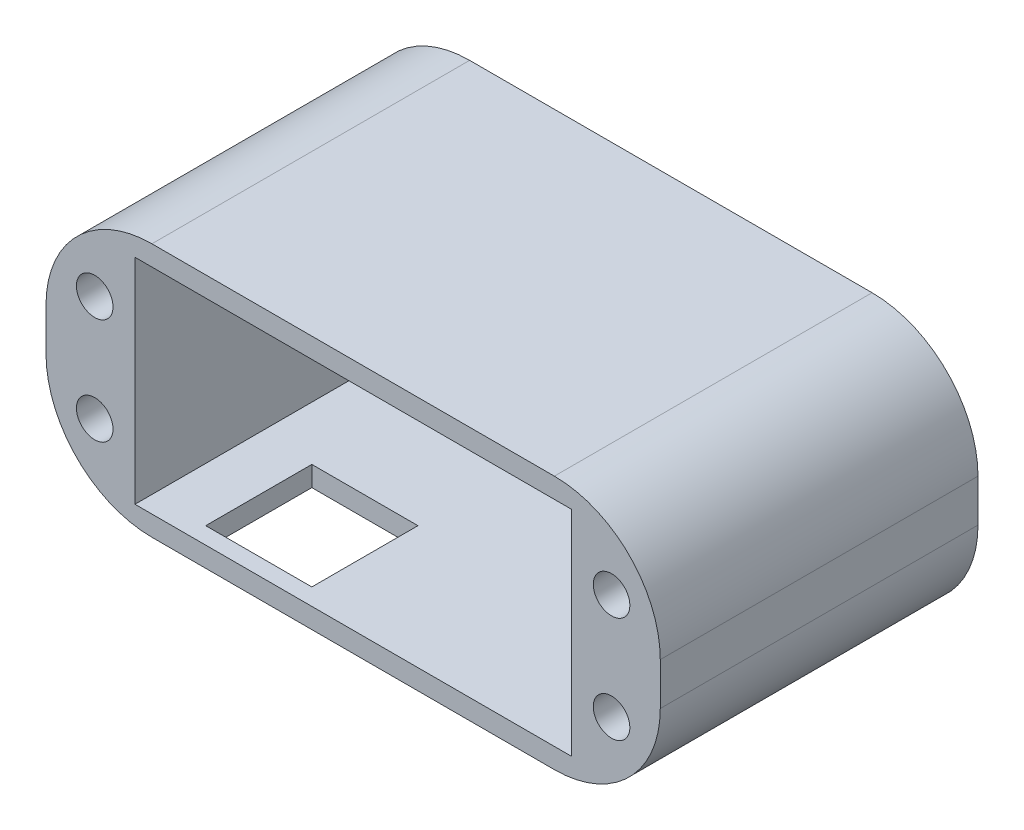
ISO-10303-21;
HEADER;
FILE_DESCRIPTION(('STEP AP214'),'2;1');
FILE_NAME('part.step','',(''),(''),'','','');
FILE_SCHEMA(('AUTOMOTIVE_DESIGN { 1 0 10303 214 1 1 1 1 }'));
ENDSEC;
DATA;
#1=APPLICATION_CONTEXT('core data for automotive mechanical design processes');
#2=APPLICATION_PROTOCOL_DEFINITION('international standard','automotive_design',2000,#1);
#3=PRODUCT_CONTEXT('',#1,'mechanical');
#4=PRODUCT('Part','Part','',(#3));
#5=PRODUCT_RELATED_PRODUCT_CATEGORY('part','',(#4));
#6=PRODUCT_DEFINITION_FORMATION('','',#4);
#7=PRODUCT_DEFINITION_CONTEXT('part definition',#1,'design');
#8=PRODUCT_DEFINITION('design','',#6,#7);
#9=PRODUCT_DEFINITION_SHAPE('','',#8);
#10=(LENGTH_UNIT() NAMED_UNIT(*) SI_UNIT(.MILLI.,.METRE.));
#11=(NAMED_UNIT(*) PLANE_ANGLE_UNIT() SI_UNIT($,.RADIAN.));
#12=(NAMED_UNIT(*) SI_UNIT($,.STERADIAN.) SOLID_ANGLE_UNIT());
#13=UNCERTAINTY_MEASURE_WITH_UNIT(LENGTH_MEASURE(1.E-05),#10,'distance_accuracy_value','');
#14=(GEOMETRIC_REPRESENTATION_CONTEXT(3) GLOBAL_UNCERTAINTY_ASSIGNED_CONTEXT((#13)) GLOBAL_UNIT_ASSIGNED_CONTEXT((#10,
#11,#12)) REPRESENTATION_CONTEXT('',''));
#15=CARTESIAN_POINT('',(0.,0.,0.));
#16=DIRECTION('',(0.,0.,1.));
#17=DIRECTION('',(1.,0.,0.));
#18=AXIS2_PLACEMENT_3D('',#15,#16,#17);
#19=CARTESIAN_POINT('',(-29.,-12.,-30.));
#20=DIRECTION('',(-1.,0.,0.));
#21=DIRECTION('',(0.,0.,1.));
#22=AXIS2_PLACEMENT_3D('',#19,#20,#21);
#23=PLANE('',#22);
#24=DIRECTION('',(0.,-1.,0.));
#25=VECTOR('',#24,1.);
#26=CARTESIAN_POINT('',(-29.,-12.,-30.));
#27=LINE('',#26,#25);
#28=CARTESIAN_POINT('',(-29.,2.,-30.));
#29=VERTEX_POINT('',#28);
#30=CARTESIAN_POINT('',(-29.,-2.00000000000001,-30.));
#31=VERTEX_POINT('',#30);
#32=EDGE_CURVE('E268',#29,#31,#27,.T.);
#33=ORIENTED_EDGE('',*,*,#32,.T.);
#34=DIRECTION('',(0.,0.,1.));
#35=VECTOR('',#34,1.);
#36=CARTESIAN_POINT('',(-29.,-2.00000000000001,-30.));
#37=LINE('',#36,#35);
#38=CARTESIAN_POINT('',(-29.,-2.00000000000001,0.));
#39=VERTEX_POINT('',#38);
#40=EDGE_CURVE('E314',#31,#39,#37,.T.);
#41=ORIENTED_EDGE('',*,*,#40,.T.);
#42=DIRECTION('',(0.,-1.,0.));
#43=VECTOR('',#42,1.);
#44=CARTESIAN_POINT('',(-29.,-12.,0.));
#45=LINE('',#44,#43);
#46=CARTESIAN_POINT('',(-29.,2.,0.));
#47=VERTEX_POINT('',#46);
#48=EDGE_CURVE('E267',#47,#39,#45,.T.);
#49=ORIENTED_EDGE('',*,*,#48,.F.);
#50=DIRECTION('',(0.,0.,1.));
#51=VECTOR('',#50,1.);
#52=CARTESIAN_POINT('',(-29.,2.,-30.));
#53=LINE('',#52,#51);
#54=EDGE_CURVE('E289',#47,#29,#53,.F.);
#55=ORIENTED_EDGE('',*,*,#54,.T.);
#56=EDGE_LOOP('',(#33,#41,#49,#55));
#57=FACE_BOUND('',#56,.T.);
#58=ADVANCED_FACE('F40',(#57),#23,.T.);
#59=CARTESIAN_POINT('',(29.,12.,-30.));
#60=DIRECTION('',(0.,1.,0.));
#61=DIRECTION('',(-1.,0.,0.));
#62=AXIS2_PLACEMENT_3D('',#59,#60,#61);
#63=PLANE('',#62);
#64=DIRECTION('',(-1.,0.,0.));
#65=VECTOR('',#64,1.);
#66=CARTESIAN_POINT('',(29.,12.,0.));
#67=LINE('',#66,#65);
#68=CARTESIAN_POINT('',(19.,12.,0.));
#69=VERTEX_POINT('',#68);
#70=CARTESIAN_POINT('',(-19.,12.,0.));
#71=VERTEX_POINT('',#70);
#72=EDGE_CURVE('E272',#69,#71,#67,.T.);
#73=ORIENTED_EDGE('',*,*,#72,.F.);
#74=DIRECTION('',(0.,0.,1.));
#75=VECTOR('',#74,1.);
#76=CARTESIAN_POINT('',(19.,12.,-30.));
#77=LINE('',#76,#75);
#78=CARTESIAN_POINT('',(19.,12.,-30.));
#79=VERTEX_POINT('',#78);
#80=EDGE_CURVE('E299',#69,#79,#77,.F.);
#81=ORIENTED_EDGE('',*,*,#80,.T.);
#82=DIRECTION('',(-1.,0.,0.));
#83=VECTOR('',#82,1.);
#84=CARTESIAN_POINT('',(29.,12.,-30.));
#85=LINE('',#84,#83);
#86=CARTESIAN_POINT('',(-19.,12.,-30.));
#87=VERTEX_POINT('',#86);
#88=EDGE_CURVE('E276',#79,#87,#85,.T.);
#89=ORIENTED_EDGE('',*,*,#88,.T.);
#90=DIRECTION('',(0.,0.,1.));
#91=VECTOR('',#90,1.);
#92=CARTESIAN_POINT('',(-19.,12.,-30.));
#93=LINE('',#92,#91);
#94=EDGE_CURVE('E278',#87,#71,#93,.T.);
#95=ORIENTED_EDGE('',*,*,#94,.T.);
#96=EDGE_LOOP('',(#73,#81,#89,#95));
#97=FACE_BOUND('',#96,.T.);
#98=ADVANCED_FACE('F332',(#97),#63,.T.);
#99=CARTESIAN_POINT('',(29.,-12.,-30.));
#100=DIRECTION('',(1.,0.,0.));
#101=DIRECTION('',(0.,0.,-1.));
#102=AXIS2_PLACEMENT_3D('',#99,#100,#101);
#103=PLANE('',#102);
#104=DIRECTION('',(0.,1.,0.));
#105=VECTOR('',#104,1.);
#106=CARTESIAN_POINT('',(29.,-12.,0.));
#107=LINE('',#106,#105);
#108=CARTESIAN_POINT('',(29.,-2.,0.));
#109=VERTEX_POINT('',#108);
#110=CARTESIAN_POINT('',(29.,2.,0.));
#111=VERTEX_POINT('',#110);
#112=EDGE_CURVE('E282',#109,#111,#107,.T.);
#113=ORIENTED_EDGE('',*,*,#112,.F.);
#114=DIRECTION('',(0.,0.,1.));
#115=VECTOR('',#114,1.);
#116=CARTESIAN_POINT('',(29.,-2.,-30.));
#117=LINE('',#116,#115);
#118=CARTESIAN_POINT('',(29.,-2.,-30.));
#119=VERTEX_POINT('',#118);
#120=EDGE_CURVE('E309',#109,#119,#117,.F.);
#121=ORIENTED_EDGE('',*,*,#120,.T.);
#122=DIRECTION('',(0.,1.,0.));
#123=VECTOR('',#122,1.);
#124=CARTESIAN_POINT('',(29.,-12.,-30.));
#125=LINE('',#124,#123);
#126=CARTESIAN_POINT('',(29.,2.,-30.));
#127=VERTEX_POINT('',#126);
#128=EDGE_CURVE('E274',#119,#127,#125,.T.);
#129=ORIENTED_EDGE('',*,*,#128,.T.);
#130=DIRECTION('',(0.,0.,1.));
#131=VECTOR('',#130,1.);
#132=CARTESIAN_POINT('',(29.,2.,-30.));
#133=LINE('',#132,#131);
#134=EDGE_CURVE('E294',#127,#111,#133,.T.);
#135=ORIENTED_EDGE('',*,*,#134,.T.);
#136=EDGE_LOOP('',(#113,#121,#129,#135));
#137=FACE_BOUND('',#136,.T.);
#138=ADVANCED_FACE('F350',(#137),#103,.T.);
#139=CARTESIAN_POINT('',(29.,-12.,-30.));
#140=DIRECTION('',(0.,-1.,0.));
#141=DIRECTION('',(1.,0.,0.));
#142=AXIS2_PLACEMENT_3D('',#139,#140,#141);
#143=PLANE('',#142);
#144=DIRECTION('',(0.,0.,1.));
#145=VECTOR('',#144,1.);
#146=CARTESIAN_POINT('',(-5.48999999999954,-12.,-30.));
#147=LINE('',#146,#145);
#148=CARTESIAN_POINT('',(-5.48999999999954,-12.,-11.6100000000011));
#149=VERTEX_POINT('',#148);
#150=CARTESIAN_POINT('',(-5.48999999999954,-12.,-1.59000000000109));
#151=VERTEX_POINT('',#150);
#152=EDGE_CURVE('E203',#149,#151,#147,.T.);
#153=ORIENTED_EDGE('',*,*,#152,.F.);
#154=DIRECTION('',(1.,0.,0.));
#155=VECTOR('',#154,1.);
#156=CARTESIAN_POINT('',(29.,-12.,-11.6100000000011));
#157=LINE('',#156,#155);
#158=CARTESIAN_POINT('',(-15.5099999999995,-12.,-11.6100000000011));
#159=VERTEX_POINT('',#158);
#160=EDGE_CURVE('E196',#159,#149,#157,.T.);
#161=ORIENTED_EDGE('',*,*,#160,.F.);
#162=DIRECTION('',(0.,0.,-1.));
#163=VECTOR('',#162,1.);
#164=CARTESIAN_POINT('',(-15.5099999999995,-12.,-30.));
#165=LINE('',#164,#163);
#166=CARTESIAN_POINT('',(-15.5099999999995,-12.,-1.59000000000109));
#167=VERTEX_POINT('',#166);
#168=EDGE_CURVE('E171',#167,#159,#165,.T.);
#169=ORIENTED_EDGE('',*,*,#168,.F.);
#170=DIRECTION('',(-1.,0.,0.));
#171=VECTOR('',#170,1.);
#172=CARTESIAN_POINT('',(29.,-12.,-1.59000000000109));
#173=LINE('',#172,#171);
#174=EDGE_CURVE('E201',#151,#167,#173,.T.);
#175=ORIENTED_EDGE('',*,*,#174,.F.);
#176=EDGE_LOOP('',(#153,#161,#169,#175));
#177=FACE_BOUND('',#176,.T.);
#178=DIRECTION('',(1.,0.,0.));
#179=VECTOR('',#178,1.);
#180=CARTESIAN_POINT('',(29.,-12.,0.));
#181=LINE('',#180,#179);
#182=CARTESIAN_POINT('',(-19.,-12.,0.));
#183=VERTEX_POINT('',#182);
#184=CARTESIAN_POINT('',(19.,-12.,0.));
#185=VERTEX_POINT('',#184);
#186=EDGE_CURVE('E280',#183,#185,#181,.T.);
#187=ORIENTED_EDGE('',*,*,#186,.F.);
#188=DIRECTION('',(0.,0.,1.));
#189=VECTOR('',#188,1.);
#190=CARTESIAN_POINT('',(-19.,-12.,-30.));
#191=LINE('',#190,#189);
#192=CARTESIAN_POINT('',(-19.,-12.,-30.));
#193=VERTEX_POINT('',#192);
#194=EDGE_CURVE('E48',#183,#193,#191,.F.);
#195=ORIENTED_EDGE('',*,*,#194,.T.);
#196=DIRECTION('',(1.,0.,0.));
#197=VECTOR('',#196,1.);
#198=CARTESIAN_POINT('',(29.,-12.,-30.));
#199=LINE('',#198,#197);
#200=CARTESIAN_POINT('',(19.,-12.,-30.));
#201=VERTEX_POINT('',#200);
#202=EDGE_CURVE('E271',#193,#201,#199,.T.);
#203=ORIENTED_EDGE('',*,*,#202,.T.);
#204=DIRECTION('',(0.,0.,1.));
#205=VECTOR('',#204,1.);
#206=CARTESIAN_POINT('',(19.,-12.,-30.));
#207=LINE('',#206,#205);
#208=EDGE_CURVE('E304',#201,#185,#207,.T.);
#209=ORIENTED_EDGE('',*,*,#208,.T.);
#210=EDGE_LOOP('',(#187,#195,#203,#209));
#211=FACE_BOUND('',#210,.T.);
#212=ADVANCED_FACE('F354',(#177,#211),#143,.T.);
#213=CARTESIAN_POINT('',(0.,0.,-30.));
#214=DIRECTION('',(0.,0.,1.));
#215=DIRECTION('',(1.,0.,0.));
#216=AXIS2_PLACEMENT_3D('',#213,#214,#215);
#217=PLANE('',#216);
#218=CARTESIAN_POINT('',(-10.5000000000002,-1.33805068712554E-13,-30.));
#219=DIRECTION('',(0.,0.,-1.));
#220=DIRECTION('',(-1.,0.,0.));
#221=AXIS2_PLACEMENT_3D('',#218,#219,#220);
#222=CIRCLE('',#221,1.50500000000002);
#223=CARTESIAN_POINT('',(-12.0050000000002,-1.33805068712554E-13,-30.));
#224=VERTEX_POINT('',#223);
#225=EDGE_CURVE('E205',#224,#224,#222,.T.);
#226=ORIENTED_EDGE('',*,*,#225,.F.);
#227=EDGE_LOOP('',(#226));
#228=FACE_BOUND('',#227,.T.);
#229=ORIENTED_EDGE('',*,*,#202,.F.);
#230=CARTESIAN_POINT('',(-19.,-2.00000000000001,-30.));
#231=DIRECTION('',(0.,0.,1.));
#232=DIRECTION('',(1.,0.,0.));
#233=AXIS2_PLACEMENT_3D('',#230,#231,#232);
#234=CIRCLE('',#233,10.);
#235=EDGE_CURVE('E11',#193,#31,#234,.F.);
#236=ORIENTED_EDGE('',*,*,#235,.T.);
#237=ORIENTED_EDGE('',*,*,#32,.F.);
#238=CARTESIAN_POINT('',(-19.,2.,-30.));
#239=DIRECTION('',(0.,0.,1.));
#240=DIRECTION('',(1.,0.,0.));
#241=AXIS2_PLACEMENT_3D('',#238,#239,#240);
#242=CIRCLE('',#241,10.);
#243=EDGE_CURVE('E291',#29,#87,#242,.F.);
#244=ORIENTED_EDGE('',*,*,#243,.T.);
#245=ORIENTED_EDGE('',*,*,#88,.F.);
#246=CARTESIAN_POINT('',(19.,2.,-30.));
#247=DIRECTION('',(0.,0.,1.));
#248=DIRECTION('',(1.,0.,0.));
#249=AXIS2_PLACEMENT_3D('',#246,#247,#248);
#250=CIRCLE('',#249,10.);
#251=EDGE_CURVE('E301',#79,#127,#250,.F.);
#252=ORIENTED_EDGE('',*,*,#251,.T.);
#253=ORIENTED_EDGE('',*,*,#128,.F.);
#254=CARTESIAN_POINT('',(19.,-2.,-30.));
#255=DIRECTION('',(0.,0.,1.));
#256=DIRECTION('',(1.,0.,0.));
#257=AXIS2_PLACEMENT_3D('',#254,#255,#256);
#258=CIRCLE('',#257,10.);
#259=EDGE_CURVE('E311',#119,#201,#258,.F.);
#260=ORIENTED_EDGE('',*,*,#259,.T.);
#261=EDGE_LOOP('',(#229,#236,#237,#244,#245,#252,#253,#260));
#262=FACE_BOUND('',#261,.T.);
#263=ADVANCED_FACE('F337',(#228,#262),#217,.F.);
#264=CARTESIAN_POINT('',(0.,0.,0.));
#265=DIRECTION('',(0.,0.,1.));
#266=DIRECTION('',(1.,0.,0.));
#267=AXIS2_PLACEMENT_3D('',#264,#265,#266);
#268=PLANE('',#267);
#269=DIRECTION('',(0.,-1.,0.));
#270=VECTOR('',#269,1.);
#271=CARTESIAN_POINT('',(-20.6,10.1,0.));
#272=LINE('',#271,#270);
#273=CARTESIAN_POINT('',(-20.6,10.1,0.));
#274=VERTEX_POINT('',#273);
#275=CARTESIAN_POINT('',(-20.6,-10.1,0.));
#276=VERTEX_POINT('',#275);
#277=EDGE_CURVE('E209',#274,#276,#272,.T.);
#278=ORIENTED_EDGE('',*,*,#277,.F.);
#279=DIRECTION('',(-1.,0.,0.));
#280=VECTOR('',#279,1.);
#281=CARTESIAN_POINT('',(20.6,10.1,0.));
#282=LINE('',#281,#280);
#283=CARTESIAN_POINT('',(20.6,10.1,0.));
#284=VERTEX_POINT('',#283);
#285=EDGE_CURVE('E216',#284,#274,#282,.T.);
#286=ORIENTED_EDGE('',*,*,#285,.F.);
#287=DIRECTION('',(0.,1.,0.));
#288=VECTOR('',#287,1.);
#289=CARTESIAN_POINT('',(20.6,10.1,0.));
#290=LINE('',#289,#288);
#291=CARTESIAN_POINT('',(20.6,-10.1,0.));
#292=VERTEX_POINT('',#291);
#293=EDGE_CURVE('E230',#292,#284,#290,.T.);
#294=ORIENTED_EDGE('',*,*,#293,.F.);
#295=DIRECTION('',(1.,0.,0.));
#296=VECTOR('',#295,1.);
#297=CARTESIAN_POINT('',(20.6,-10.1,0.));
#298=LINE('',#297,#296);
#299=EDGE_CURVE('E227',#276,#292,#298,.T.);
#300=ORIENTED_EDGE('',*,*,#299,.F.);
#301=EDGE_LOOP('',(#278,#286,#294,#300));
#302=FACE_BOUND('',#301,.T.);
#303=CARTESIAN_POINT('',(24.3999999999997,-5.,0.));
#304=DIRECTION('',(0.,0.,1.));
#305=DIRECTION('',(1.,0.,0.));
#306=AXIS2_PLACEMENT_3D('',#303,#304,#305);
#307=CIRCLE('',#306,1.72719999999999);
#308=CARTESIAN_POINT('',(26.1271999999997,-5.,0.));
#309=VERTEX_POINT('',#308);
#310=EDGE_CURVE('E237',#309,#309,#307,.T.);
#311=ORIENTED_EDGE('',*,*,#310,.F.);
#312=EDGE_LOOP('',(#311));
#313=FACE_BOUND('',#312,.T.);
#314=CARTESIAN_POINT('',(24.3999999999997,5.,0.));
#315=DIRECTION('',(0.,0.,1.));
#316=DIRECTION('',(1.,0.,0.));
#317=AXIS2_PLACEMENT_3D('',#314,#315,#316);
#318=CIRCLE('',#317,1.72719999999999);
#319=CARTESIAN_POINT('',(26.1271999999997,5.,0.));
#320=VERTEX_POINT('',#319);
#321=EDGE_CURVE('E249',#320,#320,#318,.T.);
#322=ORIENTED_EDGE('',*,*,#321,.F.);
#323=EDGE_LOOP('',(#322));
#324=FACE_BOUND('',#323,.T.);
#325=CARTESIAN_POINT('',(-24.4000000000003,-5.00000000000017,0.));
#326=DIRECTION('',(0.,0.,1.));
#327=DIRECTION('',(1.,0.,0.));
#328=AXIS2_PLACEMENT_3D('',#325,#326,#327);
#329=CIRCLE('',#328,1.72719999999999);
#330=CARTESIAN_POINT('',(-22.6728000000003,-5.00000000000017,0.));
#331=VERTEX_POINT('',#330);
#332=EDGE_CURVE('E255',#331,#331,#329,.T.);
#333=ORIENTED_EDGE('',*,*,#332,.F.);
#334=EDGE_LOOP('',(#333));
#335=FACE_BOUND('',#334,.T.);
#336=CARTESIAN_POINT('',(-24.4000000000003,4.99999999999983,0.));
#337=DIRECTION('',(0.,0.,1.));
#338=DIRECTION('',(1.,0.,0.));
#339=AXIS2_PLACEMENT_3D('',#336,#337,#338);
#340=CIRCLE('',#339,1.72719999999999);
#341=CARTESIAN_POINT('',(-22.6728000000003,4.99999999999983,0.));
#342=VERTEX_POINT('',#341);
#343=EDGE_CURVE('E261',#342,#342,#340,.T.);
#344=ORIENTED_EDGE('',*,*,#343,.F.);
#345=EDGE_LOOP('',(#344));
#346=FACE_BOUND('',#345,.T.);
#347=ORIENTED_EDGE('',*,*,#48,.T.);
#348=CARTESIAN_POINT('',(-19.,-2.00000000000001,0.));
#349=DIRECTION('',(0.,0.,1.));
#350=DIRECTION('',(1.,0.,0.));
#351=AXIS2_PLACEMENT_3D('',#348,#349,#350);
#352=CIRCLE('',#351,10.);
#353=EDGE_CURVE('E62',#39,#183,#352,.T.);
#354=ORIENTED_EDGE('',*,*,#353,.T.);
#355=ORIENTED_EDGE('',*,*,#186,.T.);
#356=CARTESIAN_POINT('',(19.,-2.,0.));
#357=DIRECTION('',(0.,0.,1.));
#358=DIRECTION('',(1.,0.,0.));
#359=AXIS2_PLACEMENT_3D('',#356,#357,#358);
#360=CIRCLE('',#359,10.);
#361=EDGE_CURVE('E307',#185,#109,#360,.T.);
#362=ORIENTED_EDGE('',*,*,#361,.T.);
#363=ORIENTED_EDGE('',*,*,#112,.T.);
#364=CARTESIAN_POINT('',(19.,2.,0.));
#365=DIRECTION('',(0.,0.,1.));
#366=DIRECTION('',(1.,0.,0.));
#367=AXIS2_PLACEMENT_3D('',#364,#365,#366);
#368=CIRCLE('',#367,10.);
#369=EDGE_CURVE('E297',#111,#69,#368,.T.);
#370=ORIENTED_EDGE('',*,*,#369,.T.);
#371=ORIENTED_EDGE('',*,*,#72,.T.);
#372=CARTESIAN_POINT('',(-19.,2.,0.));
#373=DIRECTION('',(0.,0.,1.));
#374=DIRECTION('',(1.,0.,0.));
#375=AXIS2_PLACEMENT_3D('',#372,#373,#374);
#376=CIRCLE('',#375,10.);
#377=EDGE_CURVE('E287',#71,#47,#376,.T.);
#378=ORIENTED_EDGE('',*,*,#377,.T.);
#379=EDGE_LOOP('',(#347,#354,#355,#362,#363,#370,#371,#378));
#380=FACE_BOUND('',#379,.T.);
#381=ADVANCED_FACE('F324',(#302,#313,#324,#335,#346,#380),#268,.T.);
#382=CARTESIAN_POINT('',(-24.4000000000003,4.99999999999983,-12.));
#383=DIRECTION('',(0.,0.,1.));
#384=DIRECTION('',(1.,0.,0.));
#385=AXIS2_PLACEMENT_3D('',#382,#383,#384);
#386=CONICAL_SURFACE('',#385,1.72719999999999,1.02974425867665);
#387=CARTESIAN_POINT('',(-24.4000000000003,4.99999999999983,-13.0378064611844));
#388=VERTEX_POINT('',#387);
#389=VERTEX_LOOP('',#388);
#390=FACE_BOUND('',#389,.T.);
#391=CARTESIAN_POINT('',(-24.4000000000003,4.99999999999983,-12.));
#392=DIRECTION('',(0.,0.,1.));
#393=DIRECTION('',(1.,0.,0.));
#394=AXIS2_PLACEMENT_3D('',#391,#392,#393);
#395=CIRCLE('',#394,1.72719999999999);
#396=CARTESIAN_POINT('',(-22.6728000000003,4.99999999999983,-12.));
#397=VERTEX_POINT('',#396);
#398=EDGE_CURVE('E264',#397,#397,#395,.T.);
#399=ORIENTED_EDGE('',*,*,#398,.T.);
#400=EDGE_LOOP('',(#399));
#401=FACE_BOUND('',#400,.T.);
#402=ADVANCED_FACE('F379',(#390,#401),#386,.F.);
#403=CARTESIAN_POINT('',(-24.4000000000003,4.99999999999983,0.));
#404=DIRECTION('',(0.,0.,1.));
#405=DIRECTION('',(1.,0.,0.));
#406=AXIS2_PLACEMENT_3D('',#403,#404,#405);
#407=CYLINDRICAL_SURFACE('',#406,1.72719999999999);
#408=ORIENTED_EDGE('',*,*,#398,.F.);
#409=EDGE_LOOP('',(#408));
#410=FACE_BOUND('',#409,.T.);
#411=ORIENTED_EDGE('',*,*,#343,.T.);
#412=EDGE_LOOP('',(#411));
#413=FACE_BOUND('',#412,.T.);
#414=ADVANCED_FACE('F386',(#410,#413),#407,.F.);
#415=CARTESIAN_POINT('',(-24.4000000000003,-5.00000000000017,-12.));
#416=DIRECTION('',(0.,0.,1.));
#417=DIRECTION('',(1.,0.,0.));
#418=AXIS2_PLACEMENT_3D('',#415,#416,#417);
#419=CONICAL_SURFACE('',#418,1.72719999999999,1.02974425867665);
#420=CARTESIAN_POINT('',(-24.4000000000003,-5.00000000000017,-13.0378064611844));
#421=VERTEX_POINT('',#420);
#422=VERTEX_LOOP('',#421);
#423=FACE_BOUND('',#422,.T.);
#424=CARTESIAN_POINT('',(-24.4000000000003,-5.00000000000017,-12.));
#425=DIRECTION('',(0.,0.,1.));
#426=DIRECTION('',(1.,0.,0.));
#427=AXIS2_PLACEMENT_3D('',#424,#425,#426);
#428=CIRCLE('',#427,1.72719999999999);
#429=CARTESIAN_POINT('',(-22.6728000000003,-5.00000000000017,-12.));
#430=VERTEX_POINT('',#429);
#431=EDGE_CURVE('E258',#430,#430,#428,.T.);
#432=ORIENTED_EDGE('',*,*,#431,.T.);
#433=EDGE_LOOP('',(#432));
#434=FACE_BOUND('',#433,.T.);
#435=ADVANCED_FACE('F390',(#423,#434),#419,.F.);
#436=CARTESIAN_POINT('',(-24.4000000000003,-5.00000000000017,0.));
#437=DIRECTION('',(0.,0.,1.));
#438=DIRECTION('',(1.,0.,0.));
#439=AXIS2_PLACEMENT_3D('',#436,#437,#438);
#440=CYLINDRICAL_SURFACE('',#439,1.72719999999999);
#441=ORIENTED_EDGE('',*,*,#431,.F.);
#442=EDGE_LOOP('',(#441));
#443=FACE_BOUND('',#442,.T.);
#444=ORIENTED_EDGE('',*,*,#332,.T.);
#445=EDGE_LOOP('',(#444));
#446=FACE_BOUND('',#445,.T.);
#447=ADVANCED_FACE('F394',(#443,#446),#440,.F.);
#448=CARTESIAN_POINT('',(24.3999999999997,5.,-12.));
#449=DIRECTION('',(0.,0.,1.));
#450=DIRECTION('',(1.,0.,0.));
#451=AXIS2_PLACEMENT_3D('',#448,#449,#450);
#452=CONICAL_SURFACE('',#451,1.72719999999999,1.02974425867665);
#453=CARTESIAN_POINT('',(24.3999999999997,5.,-13.0378064611844));
#454=VERTEX_POINT('',#453);
#455=VERTEX_LOOP('',#454);
#456=FACE_BOUND('',#455,.T.);
#457=CARTESIAN_POINT('',(24.3999999999997,5.,-12.));
#458=DIRECTION('',(0.,0.,1.));
#459=DIRECTION('',(1.,0.,0.));
#460=AXIS2_PLACEMENT_3D('',#457,#458,#459);
#461=CIRCLE('',#460,1.72719999999999);
#462=CARTESIAN_POINT('',(26.1271999999997,5.,-12.));
#463=VERTEX_POINT('',#462);
#464=EDGE_CURVE('E252',#463,#463,#461,.T.);
#465=ORIENTED_EDGE('',*,*,#464,.T.);
#466=EDGE_LOOP('',(#465));
#467=FACE_BOUND('',#466,.T.);
#468=ADVANCED_FACE('F398',(#456,#467),#452,.F.);
#469=CARTESIAN_POINT('',(24.3999999999997,5.,0.));
#470=DIRECTION('',(0.,0.,1.));
#471=DIRECTION('',(1.,0.,0.));
#472=AXIS2_PLACEMENT_3D('',#469,#470,#471);
#473=CYLINDRICAL_SURFACE('',#472,1.72719999999999);
#474=ORIENTED_EDGE('',*,*,#464,.F.);
#475=EDGE_LOOP('',(#474));
#476=FACE_BOUND('',#475,.T.);
#477=ORIENTED_EDGE('',*,*,#321,.T.);
#478=EDGE_LOOP('',(#477));
#479=FACE_BOUND('',#478,.T.);
#480=ADVANCED_FACE('F402',(#476,#479),#473,.F.);
#481=CARTESIAN_POINT('',(24.3999999999997,-5.,-12.));
#482=DIRECTION('',(0.,0.,1.));
#483=DIRECTION('',(1.,0.,0.));
#484=AXIS2_PLACEMENT_3D('',#481,#482,#483);
#485=CONICAL_SURFACE('',#484,1.72719999999999,1.02974425867665);
#486=CARTESIAN_POINT('',(24.3999999999997,-5.,-13.0378064611844));
#487=VERTEX_POINT('',#486);
#488=VERTEX_LOOP('',#487);
#489=FACE_BOUND('',#488,.T.);
#490=CARTESIAN_POINT('',(24.3999999999997,-5.,-12.));
#491=DIRECTION('',(0.,0.,1.));
#492=DIRECTION('',(1.,0.,0.));
#493=AXIS2_PLACEMENT_3D('',#490,#491,#492);
#494=CIRCLE('',#493,1.72719999999999);
#495=CARTESIAN_POINT('',(26.1271999999997,-5.,-12.));
#496=VERTEX_POINT('',#495);
#497=EDGE_CURVE('E246',#496,#496,#494,.T.);
#498=ORIENTED_EDGE('',*,*,#497,.T.);
#499=EDGE_LOOP('',(#498));
#500=FACE_BOUND('',#499,.T.);
#501=ADVANCED_FACE('F406',(#489,#500),#485,.F.);
#502=CARTESIAN_POINT('',(24.3999999999997,-5.,0.));
#503=DIRECTION('',(0.,0.,1.));
#504=DIRECTION('',(1.,0.,0.));
#505=AXIS2_PLACEMENT_3D('',#502,#503,#504);
#506=CYLINDRICAL_SURFACE('',#505,1.72719999999999);
#507=ORIENTED_EDGE('',*,*,#497,.F.);
#508=EDGE_LOOP('',(#507));
#509=FACE_BOUND('',#508,.T.);
#510=ORIENTED_EDGE('',*,*,#310,.T.);
#511=EDGE_LOOP('',(#510));
#512=FACE_BOUND('',#511,.T.);
#513=ADVANCED_FACE('F410',(#509,#512),#506,.F.);
#514=CARTESIAN_POINT('',(-20.6,10.1,-28.));
#515=DIRECTION('',(-1.,0.,0.));
#516=DIRECTION('',(0.,0.,1.));
#517=AXIS2_PLACEMENT_3D('',#514,#515,#516);
#518=PLANE('',#517);
#519=ORIENTED_EDGE('',*,*,#277,.T.);
#520=DIRECTION('',(0.,0.,1.));
#521=VECTOR('',#520,1.);
#522=CARTESIAN_POINT('',(-20.6,-10.1,-28.));
#523=LINE('',#522,#521);
#524=CARTESIAN_POINT('',(-20.6,-10.1,-28.));
#525=VERTEX_POINT('',#524);
#526=EDGE_CURVE('E225',#525,#276,#523,.T.);
#527=ORIENTED_EDGE('',*,*,#526,.F.);
#528=DIRECTION('',(0.,-1.,0.));
#529=VECTOR('',#528,1.);
#530=CARTESIAN_POINT('',(-20.6,10.1,-28.));
#531=LINE('',#530,#529);
#532=CARTESIAN_POINT('',(-20.6,10.1,-28.));
#533=VERTEX_POINT('',#532);
#534=EDGE_CURVE('E212',#533,#525,#531,.T.);
#535=ORIENTED_EDGE('',*,*,#534,.F.);
#536=DIRECTION('',(0.,0.,1.));
#537=VECTOR('',#536,1.);
#538=CARTESIAN_POINT('',(-20.6,10.1,-28.));
#539=LINE('',#538,#537);
#540=EDGE_CURVE('E235',#533,#274,#539,.T.);
#541=ORIENTED_EDGE('',*,*,#540,.T.);
#542=EDGE_LOOP('',(#519,#527,#535,#541));
#543=FACE_BOUND('',#542,.T.);
#544=ADVANCED_FACE('F414',(#543),#518,.F.);
#545=CARTESIAN_POINT('',(20.6,10.1,-28.));
#546=DIRECTION('',(0.,1.,0.));
#547=DIRECTION('',(-1.,0.,0.));
#548=AXIS2_PLACEMENT_3D('',#545,#546,#547);
#549=PLANE('',#548);
#550=ORIENTED_EDGE('',*,*,#285,.T.);
#551=ORIENTED_EDGE('',*,*,#540,.F.);
#552=DIRECTION('',(-1.,0.,0.));
#553=VECTOR('',#552,1.);
#554=CARTESIAN_POINT('',(20.6,10.1,-28.));
#555=LINE('',#554,#553);
#556=CARTESIAN_POINT('',(20.6,10.1,-28.));
#557=VERTEX_POINT('',#556);
#558=EDGE_CURVE('E222',#557,#533,#555,.T.);
#559=ORIENTED_EDGE('',*,*,#558,.F.);
#560=DIRECTION('',(0.,0.,1.));
#561=VECTOR('',#560,1.);
#562=CARTESIAN_POINT('',(20.6,10.1,-28.));
#563=LINE('',#562,#561);
#564=EDGE_CURVE('E238',#557,#284,#563,.T.);
#565=ORIENTED_EDGE('',*,*,#564,.T.);
#566=EDGE_LOOP('',(#550,#551,#559,#565));
#567=FACE_BOUND('',#566,.T.);
#568=ADVANCED_FACE('F418',(#567),#549,.F.);
#569=CARTESIAN_POINT('',(20.6,10.1,-28.));
#570=DIRECTION('',(1.,0.,0.));
#571=DIRECTION('',(0.,1.,0.));
#572=AXIS2_PLACEMENT_3D('',#569,#570,#571);
#573=PLANE('',#572);
#574=ORIENTED_EDGE('',*,*,#293,.T.);
#575=ORIENTED_EDGE('',*,*,#564,.F.);
#576=DIRECTION('',(0.,1.,0.));
#577=VECTOR('',#576,1.);
#578=CARTESIAN_POINT('',(20.6,10.1,-28.));
#579=LINE('',#578,#577);
#580=CARTESIAN_POINT('',(20.6,-10.1,-28.));
#581=VERTEX_POINT('',#580);
#582=EDGE_CURVE('E219',#581,#557,#579,.T.);
#583=ORIENTED_EDGE('',*,*,#582,.F.);
#584=DIRECTION('',(0.,0.,1.));
#585=VECTOR('',#584,1.);
#586=CARTESIAN_POINT('',(20.6,-10.1,-28.));
#587=LINE('',#586,#585);
#588=EDGE_CURVE('E240',#581,#292,#587,.T.);
#589=ORIENTED_EDGE('',*,*,#588,.T.);
#590=EDGE_LOOP('',(#574,#575,#583,#589));
#591=FACE_BOUND('',#590,.T.);
#592=ADVANCED_FACE('F423',(#591),#573,.F.);
#593=CARTESIAN_POINT('',(20.6,-10.1,-28.));
#594=DIRECTION('',(0.,-1.,0.));
#595=DIRECTION('',(1.,0.,0.));
#596=AXIS2_PLACEMENT_3D('',#593,#594,#595);
#597=PLANE('',#596);
#598=DIRECTION('',(-1.,0.,0.));
#599=VECTOR('',#598,1.);
#600=CARTESIAN_POINT('',(-15.5099999999995,-10.1,-11.6100000000011));
#601=LINE('',#600,#599);
#602=CARTESIAN_POINT('',(-5.48999999999954,-10.1,-11.6100000000011));
#603=VERTEX_POINT('',#602);
#604=CARTESIAN_POINT('',(-15.5099999999995,-10.1,-11.6100000000011));
#605=VERTEX_POINT('',#604);
#606=EDGE_CURVE('E179',#603,#605,#601,.T.);
#607=ORIENTED_EDGE('',*,*,#606,.F.);
#608=DIRECTION('',(0.,0.,-1.));
#609=VECTOR('',#608,1.);
#610=CARTESIAN_POINT('',(-5.48999999999954,-10.1,-1.59000000000109));
#611=LINE('',#610,#609);
#612=CARTESIAN_POINT('',(-5.48999999999954,-10.1,-1.59000000000109));
#613=VERTEX_POINT('',#612);
#614=EDGE_CURVE('E184',#613,#603,#611,.T.);
#615=ORIENTED_EDGE('',*,*,#614,.F.);
#616=DIRECTION('',(1.,0.,0.));
#617=VECTOR('',#616,1.);
#618=CARTESIAN_POINT('',(-15.5099999999995,-10.1,-1.59000000000109));
#619=LINE('',#618,#617);
#620=CARTESIAN_POINT('',(-15.5099999999995,-10.1,-1.59000000000109));
#621=VERTEX_POINT('',#620);
#622=EDGE_CURVE('E189',#621,#613,#619,.T.);
#623=ORIENTED_EDGE('',*,*,#622,.F.);
#624=DIRECTION('',(0.,0.,1.));
#625=VECTOR('',#624,1.);
#626=CARTESIAN_POINT('',(-15.5099999999995,-10.1,-1.59000000000109));
#627=LINE('',#626,#625);
#628=EDGE_CURVE('E168',#605,#621,#627,.T.);
#629=ORIENTED_EDGE('',*,*,#628,.F.);
#630=EDGE_LOOP('',(#607,#615,#623,#629));
#631=FACE_BOUND('',#630,.T.);
#632=ORIENTED_EDGE('',*,*,#299,.T.);
#633=ORIENTED_EDGE('',*,*,#588,.F.);
#634=DIRECTION('',(1.,0.,0.));
#635=VECTOR('',#634,1.);
#636=CARTESIAN_POINT('',(20.6,-10.1,-28.));
#637=LINE('',#636,#635);
#638=EDGE_CURVE('E215',#525,#581,#637,.T.);
#639=ORIENTED_EDGE('',*,*,#638,.F.);
#640=ORIENTED_EDGE('',*,*,#526,.T.);
#641=EDGE_LOOP('',(#632,#633,#639,#640));
#642=FACE_BOUND('',#641,.T.);
#643=ADVANCED_FACE('F186',(#631,#642),#597,.F.);
#644=CARTESIAN_POINT('',(0.,0.,-28.));
#645=DIRECTION('',(0.,0.,-1.));
#646=DIRECTION('',(-1.,0.,0.));
#647=AXIS2_PLACEMENT_3D('',#644,#645,#646);
#648=PLANE('',#647);
#649=CARTESIAN_POINT('',(-10.5000000000002,-1.33805068712554E-13,-28.));
#650=DIRECTION('',(0.,0.,-1.));
#651=DIRECTION('',(-1.,0.,0.));
#652=AXIS2_PLACEMENT_3D('',#649,#650,#651);
#653=CIRCLE('',#652,1.50500000000002);
#654=CARTESIAN_POINT('',(-12.0050000000002,-1.33805068712554E-13,-28.));
#655=VERTEX_POINT('',#654);
#656=EDGE_CURVE('E206',#655,#655,#653,.T.);
#657=ORIENTED_EDGE('',*,*,#656,.T.);
#658=EDGE_LOOP('',(#657));
#659=FACE_BOUND('',#658,.T.);
#660=ORIENTED_EDGE('',*,*,#534,.T.);
#661=ORIENTED_EDGE('',*,*,#638,.T.);
#662=ORIENTED_EDGE('',*,*,#582,.T.);
#663=ORIENTED_EDGE('',*,*,#558,.T.);
#664=EDGE_LOOP('',(#660,#661,#662,#663));
#665=FACE_BOUND('',#664,.T.);
#666=ADVANCED_FACE('F422',(#659,#665),#648,.F.);
#667=CARTESIAN_POINT('',(-10.5000000000002,-1.33805068712554E-13,-28.));
#668=DIRECTION('',(0.,0.,-1.));
#669=DIRECTION('',(-1.,0.,0.));
#670=AXIS2_PLACEMENT_3D('',#667,#668,#669);
#671=CYLINDRICAL_SURFACE('',#670,1.50500000000002);
#672=ORIENTED_EDGE('',*,*,#656,.F.);
#673=EDGE_LOOP('',(#672));
#674=FACE_BOUND('',#673,.T.);
#675=ORIENTED_EDGE('',*,*,#225,.T.);
#676=EDGE_LOOP('',(#675));
#677=FACE_BOUND('',#676,.T.);
#678=ADVANCED_FACE('F432',(#674,#677),#671,.F.);
#679=CARTESIAN_POINT('',(-5.48999999999954,-12.1,-1.59000000000109));
#680=DIRECTION('',(1.,0.,0.));
#681=DIRECTION('',(0.,1.,0.));
#682=AXIS2_PLACEMENT_3D('',#679,#680,#681);
#683=PLANE('',#682);
#684=ORIENTED_EDGE('',*,*,#152,.T.);
#685=DIRECTION('',(0.,1.,0.));
#686=VECTOR('',#685,1.);
#687=CARTESIAN_POINT('',(-5.48999999999954,-12.1,-1.59000000000109));
#688=LINE('',#687,#686);
#689=EDGE_CURVE('E194',#151,#613,#688,.T.);
#690=ORIENTED_EDGE('',*,*,#689,.T.);
#691=ORIENTED_EDGE('',*,*,#614,.T.);
#692=DIRECTION('',(0.,1.,0.));
#693=VECTOR('',#692,1.);
#694=CARTESIAN_POINT('',(-5.48999999999954,-12.1,-11.6100000000011));
#695=LINE('',#694,#693);
#696=EDGE_CURVE('E175',#149,#603,#695,.T.);
#697=ORIENTED_EDGE('',*,*,#696,.F.);
#698=EDGE_LOOP('',(#684,#690,#691,#697));
#699=FACE_BOUND('',#698,.T.);
#700=ADVANCED_FACE('F436',(#699),#683,.F.);
#701=CARTESIAN_POINT('',(-15.5099999999995,-12.1,-1.59000000000109));
#702=DIRECTION('',(0.,0.,1.));
#703=DIRECTION('',(1.,0.,0.));
#704=AXIS2_PLACEMENT_3D('',#701,#702,#703);
#705=PLANE('',#704);
#706=ORIENTED_EDGE('',*,*,#174,.T.);
#707=DIRECTION('',(0.,1.,0.));
#708=VECTOR('',#707,1.);
#709=CARTESIAN_POINT('',(-15.5099999999995,-12.1,-1.59000000000109));
#710=LINE('',#709,#708);
#711=EDGE_CURVE('E174',#167,#621,#710,.T.);
#712=ORIENTED_EDGE('',*,*,#711,.T.);
#713=ORIENTED_EDGE('',*,*,#622,.T.);
#714=ORIENTED_EDGE('',*,*,#689,.F.);
#715=EDGE_LOOP('',(#706,#712,#713,#714));
#716=FACE_BOUND('',#715,.T.);
#717=ADVANCED_FACE('F440',(#716),#705,.F.);
#718=CARTESIAN_POINT('',(-15.5099999999995,-12.1,-1.59000000000109));
#719=DIRECTION('',(-1.,0.,0.));
#720=DIRECTION('',(0.,-1.,0.));
#721=AXIS2_PLACEMENT_3D('',#718,#719,#720);
#722=PLANE('',#721);
#723=ORIENTED_EDGE('',*,*,#168,.T.);
#724=DIRECTION('',(0.,1.,0.));
#725=VECTOR('',#724,1.);
#726=CARTESIAN_POINT('',(-15.5099999999995,-12.1,-11.6100000000011));
#727=LINE('',#726,#725);
#728=EDGE_CURVE('E163',#159,#605,#727,.T.);
#729=ORIENTED_EDGE('',*,*,#728,.T.);
#730=ORIENTED_EDGE('',*,*,#628,.T.);
#731=ORIENTED_EDGE('',*,*,#711,.F.);
#732=EDGE_LOOP('',(#723,#729,#730,#731));
#733=FACE_BOUND('',#732,.T.);
#734=ADVANCED_FACE('F165',(#733),#722,.F.);
#735=CARTESIAN_POINT('',(-15.5099999999995,-12.1,-11.6100000000011));
#736=DIRECTION('',(0.,0.,-1.));
#737=DIRECTION('',(-1.,0.,0.));
#738=AXIS2_PLACEMENT_3D('',#735,#736,#737);
#739=PLANE('',#738);
#740=ORIENTED_EDGE('',*,*,#160,.T.);
#741=ORIENTED_EDGE('',*,*,#696,.T.);
#742=ORIENTED_EDGE('',*,*,#606,.T.);
#743=ORIENTED_EDGE('',*,*,#728,.F.);
#744=EDGE_LOOP('',(#740,#741,#742,#743));
#745=FACE_BOUND('',#744,.T.);
#746=ADVANCED_FACE('F180',(#745),#739,.F.);
#747=CARTESIAN_POINT('',(-19.,2.,-30.));
#748=DIRECTION('',(0.,0.,1.));
#749=DIRECTION('',(1.,0.,0.));
#750=AXIS2_PLACEMENT_3D('',#747,#748,#749);
#751=CYLINDRICAL_SURFACE('',#750,10.);
#752=ORIENTED_EDGE('',*,*,#243,.F.);
#753=ORIENTED_EDGE('',*,*,#54,.F.);
#754=ORIENTED_EDGE('',*,*,#377,.F.);
#755=ORIENTED_EDGE('',*,*,#94,.F.);
#756=EDGE_LOOP('',(#752,#753,#754,#755));
#757=FACE_BOUND('',#756,.T.);
#758=ADVANCED_FACE('F330',(#757),#751,.T.);
#759=CARTESIAN_POINT('',(19.,2.,-30.));
#760=DIRECTION('',(0.,0.,1.));
#761=DIRECTION('',(1.,0.,0.));
#762=AXIS2_PLACEMENT_3D('',#759,#760,#761);
#763=CYLINDRICAL_SURFACE('',#762,10.);
#764=ORIENTED_EDGE('',*,*,#251,.F.);
#765=ORIENTED_EDGE('',*,*,#80,.F.);
#766=ORIENTED_EDGE('',*,*,#369,.F.);
#767=ORIENTED_EDGE('',*,*,#134,.F.);
#768=EDGE_LOOP('',(#764,#765,#766,#767));
#769=FACE_BOUND('',#768,.T.);
#770=ADVANCED_FACE('F343',(#769),#763,.T.);
#771=CARTESIAN_POINT('',(19.,-2.,-30.));
#772=DIRECTION('',(0.,0.,1.));
#773=DIRECTION('',(1.,0.,0.));
#774=AXIS2_PLACEMENT_3D('',#771,#772,#773);
#775=CYLINDRICAL_SURFACE('',#774,10.);
#776=ORIENTED_EDGE('',*,*,#259,.F.);
#777=ORIENTED_EDGE('',*,*,#120,.F.);
#778=ORIENTED_EDGE('',*,*,#361,.F.);
#779=ORIENTED_EDGE('',*,*,#208,.F.);
#780=EDGE_LOOP('',(#776,#777,#778,#779));
#781=FACE_BOUND('',#780,.T.);
#782=ADVANCED_FACE('F339',(#781),#775,.T.);
#783=CARTESIAN_POINT('',(-19.,-2.00000000000001,-30.));
#784=DIRECTION('',(0.,0.,1.));
#785=DIRECTION('',(1.,0.,0.));
#786=AXIS2_PLACEMENT_3D('',#783,#784,#785);
#787=CYLINDRICAL_SURFACE('',#786,10.);
#788=ORIENTED_EDGE('',*,*,#235,.F.);
#789=ORIENTED_EDGE('',*,*,#194,.F.);
#790=ORIENTED_EDGE('',*,*,#353,.F.);
#791=ORIENTED_EDGE('',*,*,#40,.F.);
#792=EDGE_LOOP('',(#788,#789,#790,#791));
#793=FACE_BOUND('',#792,.T.);
#794=ADVANCED_FACE('F42',(#793),#787,.T.);
#795=CLOSED_SHELL('',(#58,#98,#138,#212,#263,#381,#402,#414,#435,#447,#468,#480,#501,#513,#544,
#568,#592,#643,#666,#678,#700,#717,#734,#746,#758,#770,#782,#794));
#796=MANIFOLD_SOLID_BREP('B2',#795);
#797=ADVANCED_BREP_SHAPE_REPRESENTATION('',(#18,#796),#14);
#798=SHAPE_DEFINITION_REPRESENTATION(#9,#797);
ENDSEC;
END-ISO-10303-21;
